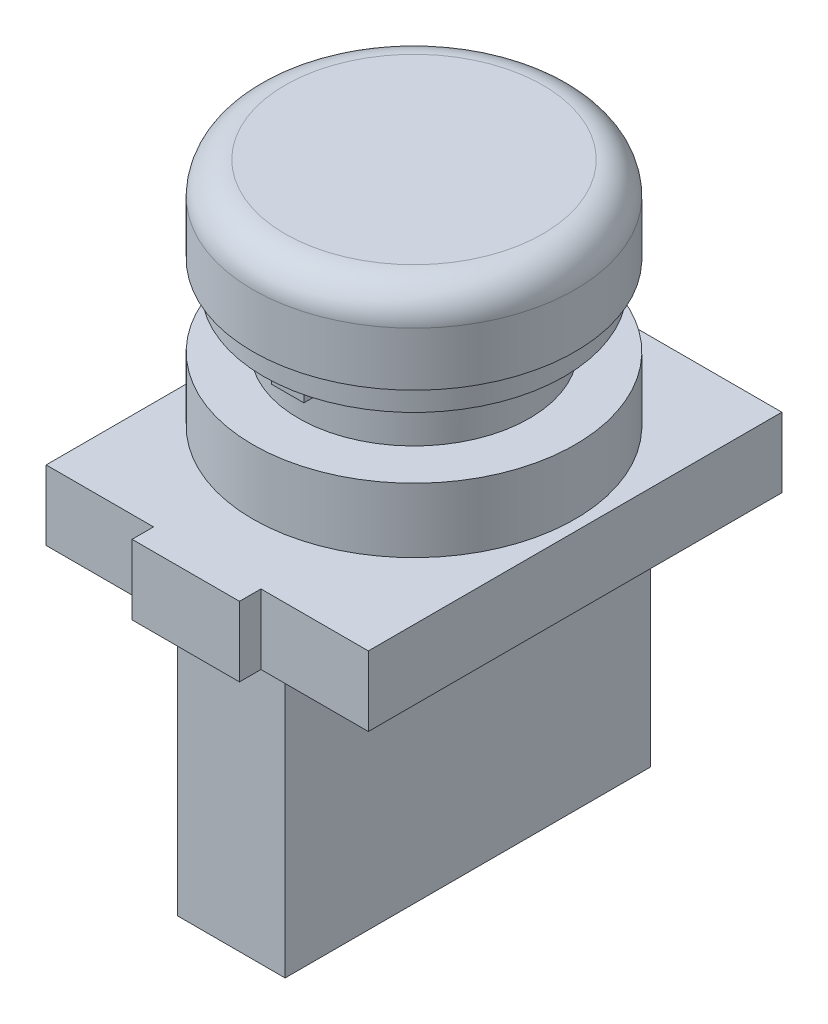
ISO-10303-21;
HEADER;
FILE_DESCRIPTION(('STEP AP214'),'2;1');
FILE_NAME('part.step','',(''),(''),'','','');
FILE_SCHEMA(('AUTOMOTIVE_DESIGN { 1 0 10303 214 1 1 1 1 }'));
ENDSEC;
DATA;
#1=APPLICATION_CONTEXT('core data for automotive mechanical design processes');
#2=APPLICATION_PROTOCOL_DEFINITION('international standard','automotive_design',2000,#1);
#3=PRODUCT_CONTEXT('',#1,'mechanical');
#4=PRODUCT('Part','Part','',(#3));
#5=PRODUCT_RELATED_PRODUCT_CATEGORY('part','',(#4));
#6=PRODUCT_DEFINITION_FORMATION('','',#4);
#7=PRODUCT_DEFINITION_CONTEXT('part definition',#1,'design');
#8=PRODUCT_DEFINITION('design','',#6,#7);
#9=PRODUCT_DEFINITION_SHAPE('','',#8);
#10=(LENGTH_UNIT() NAMED_UNIT(*) SI_UNIT(.MILLI.,.METRE.));
#11=(NAMED_UNIT(*) PLANE_ANGLE_UNIT() SI_UNIT($,.RADIAN.));
#12=(NAMED_UNIT(*) SI_UNIT($,.STERADIAN.) SOLID_ANGLE_UNIT());
#13=UNCERTAINTY_MEASURE_WITH_UNIT(LENGTH_MEASURE(1.E-05),#10,'distance_accuracy_value','');
#14=(GEOMETRIC_REPRESENTATION_CONTEXT(3) GLOBAL_UNCERTAINTY_ASSIGNED_CONTEXT((#13)) GLOBAL_UNIT_ASSIGNED_CONTEXT((#10,
#11,#12)) REPRESENTATION_CONTEXT('',''));
#15=CARTESIAN_POINT('',(0.,0.,0.));
#16=DIRECTION('',(0.,0.,1.));
#17=DIRECTION('',(1.,0.,0.));
#18=AXIS2_PLACEMENT_3D('',#15,#16,#17);
#19=CARTESIAN_POINT('',(0.,-18.5,0.));
#20=DIRECTION('',(0.,-1.,0.));
#21=DIRECTION('',(0.,0.,-1.));
#22=AXIS2_PLACEMENT_3D('',#19,#20,#21);
#23=PLANE('',#22);
#24=DIRECTION('',(1.,0.,0.));
#25=VECTOR('',#24,1.);
#26=CARTESIAN_POINT('',(0.,-18.5,19.25));
#27=LINE('',#26,#25);
#28=CARTESIAN_POINT('',(5.,-18.5,19.25));
#29=VERTEX_POINT('',#28);
#30=CARTESIAN_POINT('',(15.,-18.5,19.25));
#31=VERTEX_POINT('',#30);
#32=EDGE_CURVE('E246',#29,#31,#27,.T.);
#33=ORIENTED_EDGE('',*,*,#32,.F.);
#34=DIRECTION('',(0.,0.,-1.));
#35=VECTOR('',#34,1.);
#36=CARTESIAN_POINT('',(5.,-18.5,21.25));
#37=LINE('',#36,#35);
#38=CARTESIAN_POINT('',(5.,-18.5,21.25));
#39=VERTEX_POINT('',#38);
#40=EDGE_CURVE('E226',#39,#29,#37,.T.);
#41=ORIENTED_EDGE('',*,*,#40,.F.);
#42=DIRECTION('',(1.,0.,0.));
#43=VECTOR('',#42,1.);
#44=CARTESIAN_POINT('',(-5.,-18.5,21.25));
#45=LINE('',#44,#43);
#46=CARTESIAN_POINT('',(-5.,-18.5,21.25));
#47=VERTEX_POINT('',#46);
#48=EDGE_CURVE('E211',#47,#39,#45,.T.);
#49=ORIENTED_EDGE('',*,*,#48,.F.);
#50=DIRECTION('',(0.,0.,-1.));
#51=VECTOR('',#50,1.);
#52=CARTESIAN_POINT('',(-5.,-18.5,21.25));
#53=LINE('',#52,#51);
#54=CARTESIAN_POINT('',(-5.,-18.5,19.25));
#55=VERTEX_POINT('',#54);
#56=EDGE_CURVE('E206',#47,#55,#53,.T.);
#57=ORIENTED_EDGE('',*,*,#56,.T.);
#58=CARTESIAN_POINT('',(-15.,-18.5,19.25));
#59=VERTEX_POINT('',#58);
#60=EDGE_CURVE('E261',#59,#55,#27,.T.);
#61=ORIENTED_EDGE('',*,*,#60,.F.);
#62=DIRECTION('',(0.,0.,-1.));
#63=VECTOR('',#62,1.);
#64=CARTESIAN_POINT('',(-15.,-18.5,0.));
#65=LINE('',#64,#63);
#66=CARTESIAN_POINT('',(-15.,-18.5,-19.25));
#67=VERTEX_POINT('',#66);
#68=EDGE_CURVE('E258',#59,#67,#65,.T.);
#69=ORIENTED_EDGE('',*,*,#68,.T.);
#70=DIRECTION('',(1.,0.,0.));
#71=VECTOR('',#70,1.);
#72=CARTESIAN_POINT('',(0.,-18.5,-19.25));
#73=LINE('',#72,#71);
#74=CARTESIAN_POINT('',(15.,-18.5,-19.25));
#75=VERTEX_POINT('',#74);
#76=EDGE_CURVE('E256',#67,#75,#73,.T.);
#77=ORIENTED_EDGE('',*,*,#76,.T.);
#78=DIRECTION('',(0.,0.,-1.));
#79=VECTOR('',#78,1.);
#80=CARTESIAN_POINT('',(15.,-18.5,0.));
#81=LINE('',#80,#79);
#82=EDGE_CURVE('E242',#31,#75,#81,.T.);
#83=ORIENTED_EDGE('',*,*,#82,.F.);
#84=EDGE_LOOP('',(#33,#41,#49,#57,#61,#69,#77,#83));
#85=FACE_BOUND('',#84,.T.);
#86=DIRECTION('',(-1.,0.,0.));
#87=VECTOR('',#86,1.);
#88=CARTESIAN_POINT('',(-5.,-18.5,17.));
#89=LINE('',#88,#87);
#90=CARTESIAN_POINT('',(5.,-18.5,17.));
#91=VERTEX_POINT('',#90);
#92=CARTESIAN_POINT('',(-5.,-18.5,17.));
#93=VERTEX_POINT('',#92);
#94=EDGE_CURVE('E278',#91,#93,#89,.T.);
#95=ORIENTED_EDGE('',*,*,#94,.F.);
#96=DIRECTION('',(0.,0.,1.));
#97=VECTOR('',#96,1.);
#98=CARTESIAN_POINT('',(5.,-18.5,17.));
#99=LINE('',#98,#97);
#100=CARTESIAN_POINT('',(5.,-18.5,-17.));
#101=VERTEX_POINT('',#100);
#102=EDGE_CURVE('E281',#101,#91,#99,.T.);
#103=ORIENTED_EDGE('',*,*,#102,.F.);
#104=DIRECTION('',(1.,0.,0.));
#105=VECTOR('',#104,1.);
#106=CARTESIAN_POINT('',(-5.,-18.5,-17.));
#107=LINE('',#106,#105);
#108=CARTESIAN_POINT('',(-5.,-18.5,-17.));
#109=VERTEX_POINT('',#108);
#110=EDGE_CURVE('E273',#109,#101,#107,.T.);
#111=ORIENTED_EDGE('',*,*,#110,.F.);
#112=DIRECTION('',(0.,0.,-1.));
#113=VECTOR('',#112,1.);
#114=CARTESIAN_POINT('',(-5.,-18.5,17.));
#115=LINE('',#114,#113);
#116=EDGE_CURVE('E276',#93,#109,#115,.T.);
#117=ORIENTED_EDGE('',*,*,#116,.F.);
#118=EDGE_LOOP('',(#95,#103,#111,#117));
#119=FACE_BOUND('',#118,.T.);
#120=ADVANCED_FACE('F136',(#85,#119),#23,.T.);
#121=CARTESIAN_POINT('',(0.,-18.5,19.25));
#122=DIRECTION('',(0.,0.,1.));
#123=DIRECTION('',(1.,0.,0.));
#124=AXIS2_PLACEMENT_3D('',#121,#122,#123);
#125=PLANE('',#124);
#126=DIRECTION('',(1.,0.,0.));
#127=VECTOR('',#126,1.);
#128=CARTESIAN_POINT('',(0.,-12.,19.25));
#129=LINE('',#128,#127);
#130=CARTESIAN_POINT('',(-15.,-12.,19.25));
#131=VERTEX_POINT('',#130);
#132=CARTESIAN_POINT('',(-5.,-12.,19.25));
#133=VERTEX_POINT('',#132);
#134=EDGE_CURVE('E219',#131,#133,#129,.T.);
#135=ORIENTED_EDGE('',*,*,#134,.F.);
#136=DIRECTION('',(0.,1.,0.));
#137=VECTOR('',#136,1.);
#138=CARTESIAN_POINT('',(-15.,-18.5,19.25));
#139=LINE('',#138,#137);
#140=EDGE_CURVE('E234',#59,#131,#139,.T.);
#141=ORIENTED_EDGE('',*,*,#140,.F.);
#142=ORIENTED_EDGE('',*,*,#60,.T.);
#143=DIRECTION('',(0.,1.,0.));
#144=VECTOR('',#143,1.);
#145=CARTESIAN_POINT('',(-5.,-18.5,19.25));
#146=LINE('',#145,#144);
#147=EDGE_CURVE('E145',#55,#133,#146,.T.);
#148=ORIENTED_EDGE('',*,*,#147,.T.);
#149=EDGE_LOOP('',(#135,#141,#142,#148));
#150=FACE_BOUND('',#149,.T.);
#151=ADVANCED_FACE('F347',(#150),#125,.T.);
#152=CARTESIAN_POINT('',(-15.,-18.5,0.));
#153=DIRECTION('',(1.,0.,0.));
#154=DIRECTION('',(0.,0.,-1.));
#155=AXIS2_PLACEMENT_3D('',#152,#153,#154);
#156=PLANE('',#155);
#157=DIRECTION('',(0.,0.,-1.));
#158=VECTOR('',#157,1.);
#159=CARTESIAN_POINT('',(-15.,-12.,0.));
#160=LINE('',#159,#158);
#161=CARTESIAN_POINT('',(-15.,-12.,-19.25));
#162=VERTEX_POINT('',#161);
#163=EDGE_CURVE('E250',#131,#162,#160,.T.);
#164=ORIENTED_EDGE('',*,*,#163,.T.);
#165=DIRECTION('',(0.,1.,0.));
#166=VECTOR('',#165,1.);
#167=CARTESIAN_POINT('',(-15.,-18.5,-19.25));
#168=LINE('',#167,#166);
#169=EDGE_CURVE('E236',#67,#162,#168,.T.);
#170=ORIENTED_EDGE('',*,*,#169,.F.);
#171=ORIENTED_EDGE('',*,*,#68,.F.);
#172=ORIENTED_EDGE('',*,*,#140,.T.);
#173=EDGE_LOOP('',(#164,#170,#171,#172));
#174=FACE_BOUND('',#173,.T.);
#175=ADVANCED_FACE('F335',(#174),#156,.F.);
#176=CARTESIAN_POINT('',(0.,-18.5,-19.25));
#177=DIRECTION('',(0.,0.,1.));
#178=DIRECTION('',(1.,0.,0.));
#179=AXIS2_PLACEMENT_3D('',#176,#177,#178);
#180=PLANE('',#179);
#181=DIRECTION('',(1.,0.,0.));
#182=VECTOR('',#181,1.);
#183=CARTESIAN_POINT('',(0.,-12.,-19.25));
#184=LINE('',#183,#182);
#185=CARTESIAN_POINT('',(15.,-12.,-19.25));
#186=VERTEX_POINT('',#185);
#187=EDGE_CURVE('E247',#162,#186,#184,.T.);
#188=ORIENTED_EDGE('',*,*,#187,.T.);
#189=DIRECTION('',(0.,1.,0.));
#190=VECTOR('',#189,1.);
#191=CARTESIAN_POINT('',(15.,-18.5,-19.25));
#192=LINE('',#191,#190);
#193=EDGE_CURVE('E239',#75,#186,#192,.T.);
#194=ORIENTED_EDGE('',*,*,#193,.F.);
#195=ORIENTED_EDGE('',*,*,#76,.F.);
#196=ORIENTED_EDGE('',*,*,#169,.T.);
#197=EDGE_LOOP('',(#188,#194,#195,#196));
#198=FACE_BOUND('',#197,.T.);
#199=ADVANCED_FACE('F338',(#198),#180,.F.);
#200=CARTESIAN_POINT('',(15.,-18.5,0.));
#201=DIRECTION('',(1.,0.,0.));
#202=DIRECTION('',(0.,0.,-1.));
#203=AXIS2_PLACEMENT_3D('',#200,#201,#202);
#204=PLANE('',#203);
#205=DIRECTION('',(0.,0.,-1.));
#206=VECTOR('',#205,1.);
#207=CARTESIAN_POINT('',(15.,-12.,0.));
#208=LINE('',#207,#206);
#209=CARTESIAN_POINT('',(15.,-12.,19.25));
#210=VERTEX_POINT('',#209);
#211=EDGE_CURVE('E243',#210,#186,#208,.T.);
#212=ORIENTED_EDGE('',*,*,#211,.F.);
#213=DIRECTION('',(0.,1.,0.));
#214=VECTOR('',#213,1.);
#215=CARTESIAN_POINT('',(15.,-18.5,19.25));
#216=LINE('',#215,#214);
#217=EDGE_CURVE('E162',#31,#210,#216,.T.);
#218=ORIENTED_EDGE('',*,*,#217,.F.);
#219=ORIENTED_EDGE('',*,*,#82,.T.);
#220=ORIENTED_EDGE('',*,*,#193,.T.);
#221=EDGE_LOOP('',(#212,#218,#219,#220));
#222=FACE_BOUND('',#221,.T.);
#223=ADVANCED_FACE('F339',(#222),#204,.T.);
#224=CARTESIAN_POINT('',(5.,-12.,19.25));
#225=VERTEX_POINT('',#224);
#226=EDGE_CURVE('E252',#225,#210,#129,.T.);
#227=ORIENTED_EDGE('',*,*,#226,.F.);
#228=DIRECTION('',(0.,1.,0.));
#229=VECTOR('',#228,1.);
#230=CARTESIAN_POINT('',(5.,-18.5,19.25));
#231=LINE('',#230,#229);
#232=EDGE_CURVE('E13',#29,#225,#231,.T.);
#233=ORIENTED_EDGE('',*,*,#232,.F.);
#234=ORIENTED_EDGE('',*,*,#32,.T.);
#235=ORIENTED_EDGE('',*,*,#217,.T.);
#236=EDGE_LOOP('',(#227,#233,#234,#235));
#237=FACE_BOUND('',#236,.T.);
#238=ADVANCED_FACE('F343',(#237),#125,.T.);
#239=CARTESIAN_POINT('',(0.,-12.,0.));
#240=DIRECTION('',(0.,-1.,0.));
#241=DIRECTION('',(0.,0.,-1.));
#242=AXIS2_PLACEMENT_3D('',#239,#240,#241);
#243=PLANE('',#242);
#244=DIRECTION('',(0.,0.,-1.));
#245=VECTOR('',#244,1.);
#246=CARTESIAN_POINT('',(5.,-12.,21.25));
#247=LINE('',#246,#245);
#248=CARTESIAN_POINT('',(5.,-12.,21.25));
#249=VERTEX_POINT('',#248);
#250=EDGE_CURVE('E220',#249,#225,#247,.T.);
#251=ORIENTED_EDGE('',*,*,#250,.T.);
#252=ORIENTED_EDGE('',*,*,#226,.T.);
#253=ORIENTED_EDGE('',*,*,#211,.T.);
#254=ORIENTED_EDGE('',*,*,#187,.F.);
#255=ORIENTED_EDGE('',*,*,#163,.F.);
#256=ORIENTED_EDGE('',*,*,#134,.T.);
#257=DIRECTION('',(0.,0.,-1.));
#258=VECTOR('',#257,1.);
#259=CARTESIAN_POINT('',(-5.,-12.,21.25));
#260=LINE('',#259,#258);
#261=CARTESIAN_POINT('',(-5.,-12.,21.25));
#262=VERTEX_POINT('',#261);
#263=EDGE_CURVE('E203',#262,#133,#260,.T.);
#264=ORIENTED_EDGE('',*,*,#263,.F.);
#265=DIRECTION('',(1.,0.,0.));
#266=VECTOR('',#265,1.);
#267=CARTESIAN_POINT('',(-5.,-12.,21.25));
#268=LINE('',#267,#266);
#269=EDGE_CURVE('E216',#262,#249,#268,.T.);
#270=ORIENTED_EDGE('',*,*,#269,.T.);
#271=EDGE_LOOP('',(#251,#252,#253,#254,#255,#256,#264,#270));
#272=FACE_BOUND('',#271,.T.);
#273=ADVANCED_FACE('F215',(#272),#243,.F.);
#274=CARTESIAN_POINT('',(5.,-18.5,21.25));
#275=DIRECTION('',(1.,0.,0.));
#276=DIRECTION('',(0.,0.,-1.));
#277=AXIS2_PLACEMENT_3D('',#274,#275,#276);
#278=PLANE('',#277);
#279=ORIENTED_EDGE('',*,*,#40,.T.);
#280=ORIENTED_EDGE('',*,*,#232,.T.);
#281=ORIENTED_EDGE('',*,*,#250,.F.);
#282=DIRECTION('',(0.,1.,0.));
#283=VECTOR('',#282,1.);
#284=CARTESIAN_POINT('',(5.,-18.5,21.25));
#285=LINE('',#284,#283);
#286=EDGE_CURVE('E140',#39,#249,#285,.T.);
#287=ORIENTED_EDGE('',*,*,#286,.F.);
#288=EDGE_LOOP('',(#279,#280,#281,#287));
#289=FACE_BOUND('',#288,.T.);
#290=ADVANCED_FACE('F345',(#289),#278,.T.);
#291=CARTESIAN_POINT('',(-5.,-18.5,21.25));
#292=DIRECTION('',(0.,0.,1.));
#293=DIRECTION('',(1.,0.,0.));
#294=AXIS2_PLACEMENT_3D('',#291,#292,#293);
#295=PLANE('',#294);
#296=ORIENTED_EDGE('',*,*,#269,.F.);
#297=DIRECTION('',(0.,1.,0.));
#298=VECTOR('',#297,1.);
#299=CARTESIAN_POINT('',(-5.,-18.5,21.25));
#300=LINE('',#299,#298);
#301=EDGE_CURVE('E200',#47,#262,#300,.T.);
#302=ORIENTED_EDGE('',*,*,#301,.F.);
#303=ORIENTED_EDGE('',*,*,#48,.T.);
#304=ORIENTED_EDGE('',*,*,#286,.T.);
#305=EDGE_LOOP('',(#296,#302,#303,#304));
#306=FACE_BOUND('',#305,.T.);
#307=ADVANCED_FACE('F223',(#306),#295,.T.);
#308=CARTESIAN_POINT('',(-5.,-18.5,21.25));
#309=DIRECTION('',(1.,0.,0.));
#310=DIRECTION('',(0.,0.,-1.));
#311=AXIS2_PLACEMENT_3D('',#308,#309,#310);
#312=PLANE('',#311);
#313=ORIENTED_EDGE('',*,*,#147,.F.);
#314=ORIENTED_EDGE('',*,*,#56,.F.);
#315=ORIENTED_EDGE('',*,*,#301,.T.);
#316=ORIENTED_EDGE('',*,*,#263,.T.);
#317=EDGE_LOOP('',(#313,#314,#315,#316));
#318=FACE_BOUND('',#317,.T.);
#319=ADVANCED_FACE('F138',(#318),#312,.F.);
#320=CARTESIAN_POINT('',(5.,-44.5,17.));
#321=DIRECTION('',(-1.,0.,0.));
#322=DIRECTION('',(0.,0.,1.));
#323=AXIS2_PLACEMENT_3D('',#320,#321,#322);
#324=PLANE('',#323);
#325=ORIENTED_EDGE('',*,*,#102,.T.);
#326=DIRECTION('',(0.,1.,0.));
#327=VECTOR('',#326,1.);
#328=CARTESIAN_POINT('',(5.,-44.5,17.));
#329=LINE('',#328,#327);
#330=CARTESIAN_POINT('',(5.,-44.5,17.));
#331=VERTEX_POINT('',#330);
#332=EDGE_CURVE('E221',#331,#91,#329,.T.);
#333=ORIENTED_EDGE('',*,*,#332,.F.);
#334=DIRECTION('',(0.,0.,1.));
#335=VECTOR('',#334,1.);
#336=CARTESIAN_POINT('',(5.,-44.5,17.));
#337=LINE('',#336,#335);
#338=CARTESIAN_POINT('',(5.,-44.5,-17.));
#339=VERTEX_POINT('',#338);
#340=EDGE_CURVE('E275',#339,#331,#337,.T.);
#341=ORIENTED_EDGE('',*,*,#340,.F.);
#342=DIRECTION('',(0.,1.,0.));
#343=VECTOR('',#342,1.);
#344=CARTESIAN_POINT('',(5.,-44.5,-17.));
#345=LINE('',#344,#343);
#346=EDGE_CURVE('E269',#339,#101,#345,.T.);
#347=ORIENTED_EDGE('',*,*,#346,.T.);
#348=EDGE_LOOP('',(#325,#333,#341,#347));
#349=FACE_BOUND('',#348,.T.);
#350=ADVANCED_FACE('F305',(#349),#324,.F.);
#351=CARTESIAN_POINT('',(-5.,-44.5,17.));
#352=DIRECTION('',(0.,0.,-1.));
#353=DIRECTION('',(-1.,0.,0.));
#354=AXIS2_PLACEMENT_3D('',#351,#352,#353);
#355=PLANE('',#354);
#356=ORIENTED_EDGE('',*,*,#94,.T.);
#357=DIRECTION('',(0.,1.,0.));
#358=VECTOR('',#357,1.);
#359=CARTESIAN_POINT('',(-5.,-44.5,17.));
#360=LINE('',#359,#358);
#361=CARTESIAN_POINT('',(-5.,-44.5,17.));
#362=VERTEX_POINT('',#361);
#363=EDGE_CURVE('E265',#362,#93,#360,.T.);
#364=ORIENTED_EDGE('',*,*,#363,.F.);
#365=DIRECTION('',(-1.,0.,0.));
#366=VECTOR('',#365,1.);
#367=CARTESIAN_POINT('',(-5.,-44.5,17.));
#368=LINE('',#367,#366);
#369=EDGE_CURVE('E289',#331,#362,#368,.T.);
#370=ORIENTED_EDGE('',*,*,#369,.F.);
#371=ORIENTED_EDGE('',*,*,#332,.T.);
#372=EDGE_LOOP('',(#356,#364,#370,#371));
#373=FACE_BOUND('',#372,.T.);
#374=ADVANCED_FACE('F310',(#373),#355,.F.);
#375=CARTESIAN_POINT('',(-5.,-44.5,17.));
#376=DIRECTION('',(1.,0.,0.));
#377=DIRECTION('',(0.,0.,-1.));
#378=AXIS2_PLACEMENT_3D('',#375,#376,#377);
#379=PLANE('',#378);
#380=ORIENTED_EDGE('',*,*,#116,.T.);
#381=DIRECTION('',(0.,1.,0.));
#382=VECTOR('',#381,1.);
#383=CARTESIAN_POINT('',(-5.,-44.5,-17.));
#384=LINE('',#383,#382);
#385=CARTESIAN_POINT('',(-5.,-44.5,-17.));
#386=VERTEX_POINT('',#385);
#387=EDGE_CURVE('E153',#386,#109,#384,.T.);
#388=ORIENTED_EDGE('',*,*,#387,.F.);
#389=DIRECTION('',(0.,0.,-1.));
#390=VECTOR('',#389,1.);
#391=CARTESIAN_POINT('',(-5.,-44.5,17.));
#392=LINE('',#391,#390);
#393=EDGE_CURVE('E286',#362,#386,#392,.T.);
#394=ORIENTED_EDGE('',*,*,#393,.F.);
#395=ORIENTED_EDGE('',*,*,#363,.T.);
#396=EDGE_LOOP('',(#380,#388,#394,#395));
#397=FACE_BOUND('',#396,.T.);
#398=ADVANCED_FACE('F428',(#397),#379,.F.);
#399=CARTESIAN_POINT('',(-5.,-44.5,-17.));
#400=DIRECTION('',(0.,0.,1.));
#401=DIRECTION('',(1.,0.,0.));
#402=AXIS2_PLACEMENT_3D('',#399,#400,#401);
#403=PLANE('',#402);
#404=ORIENTED_EDGE('',*,*,#110,.T.);
#405=ORIENTED_EDGE('',*,*,#346,.F.);
#406=DIRECTION('',(1.,0.,0.));
#407=VECTOR('',#406,1.);
#408=CARTESIAN_POINT('',(-5.,-44.5,-17.));
#409=LINE('',#408,#407);
#410=EDGE_CURVE('E272',#386,#339,#409,.T.);
#411=ORIENTED_EDGE('',*,*,#410,.F.);
#412=ORIENTED_EDGE('',*,*,#387,.T.);
#413=EDGE_LOOP('',(#404,#405,#411,#412));
#414=FACE_BOUND('',#413,.T.);
#415=ADVANCED_FACE('F437',(#414),#403,.F.);
#416=CARTESIAN_POINT('',(0.,-44.5,0.));
#417=DIRECTION('',(0.,-1.,0.));
#418=DIRECTION('',(0.,0.,-1.));
#419=AXIS2_PLACEMENT_3D('',#416,#417,#418);
#420=PLANE('',#419);
#421=ORIENTED_EDGE('',*,*,#340,.T.);
#422=ORIENTED_EDGE('',*,*,#369,.T.);
#423=ORIENTED_EDGE('',*,*,#393,.T.);
#424=ORIENTED_EDGE('',*,*,#410,.T.);
#425=EDGE_LOOP('',(#421,#422,#423,#424));
#426=FACE_BOUND('',#425,.T.);
#427=ADVANCED_FACE('F297',(#426),#420,.T.);
#428=CLOSED_SHELL('',(#120,#151,#175,#199,#223,#238,#273,#290,#307,#319,#350,#374,#398,#415,#427));
#429=MANIFOLD_SOLID_BREP('B2',#428);
#430=CARTESIAN_POINT('',(0.,2.5,0.));
#431=DIRECTION('',(0.,-1.,0.));
#432=DIRECTION('',(0.,0.,-1.));
#433=AXIS2_PLACEMENT_3D('',#430,#431,#432);
#434=CYLINDRICAL_SURFACE('',#433,14.);
#435=CARTESIAN_POINT('',(0.,2.5,0.));
#436=DIRECTION('',(0.,1.,0.));
#437=DIRECTION('',(0.,0.,1.));
#438=AXIS2_PLACEMENT_3D('',#435,#436,#437);
#439=CIRCLE('',#438,14.);
#440=CARTESIAN_POINT('',(0.,2.5,14.));
#441=VERTEX_POINT('',#440);
#442=EDGE_CURVE('E572',#441,#441,#439,.T.);
#443=ORIENTED_EDGE('',*,*,#442,.F.);
#444=EDGE_LOOP('',(#443));
#445=FACE_BOUND('',#444,.T.);
#446=CARTESIAN_POINT('',(0.,0.,0.));
#447=DIRECTION('',(0.,1.,0.));
#448=DIRECTION('',(0.,0.,1.));
#449=AXIS2_PLACEMENT_3D('',#446,#447,#448);
#450=CIRCLE('',#449,14.);
#451=CARTESIAN_POINT('',(0.,0.,14.));
#452=VERTEX_POINT('',#451);
#453=EDGE_CURVE('E571',#452,#452,#450,.T.);
#454=ORIENTED_EDGE('',*,*,#453,.T.);
#455=EDGE_LOOP('',(#454));
#456=FACE_BOUND('',#455,.T.);
#457=ADVANCED_FACE('F481',(#445,#456),#434,.T.);
#458=CARTESIAN_POINT('',(0.,0.,0.));
#459=DIRECTION('',(0.,1.,0.));
#460=DIRECTION('',(0.,0.,1.));
#461=AXIS2_PLACEMENT_3D('',#458,#459,#460);
#462=PLANE('',#461);
#463=DIRECTION('',(1.,0.,0.));
#464=VECTOR('',#463,1.);
#465=CARTESIAN_POINT('',(-1.5,0.,11.75));
#466=LINE('',#465,#464);
#467=CARTESIAN_POINT('',(-1.5,0.,11.75));
#468=VERTEX_POINT('',#467);
#469=CARTESIAN_POINT('',(1.5,0.,11.75));
#470=VERTEX_POINT('',#469);
#471=EDGE_CURVE('E501',#468,#470,#466,.T.);
#472=ORIENTED_EDGE('',*,*,#471,.T.);
#473=DIRECTION('',(0.,0.,-1.));
#474=VECTOR('',#473,1.);
#475=CARTESIAN_POINT('',(1.5,0.,11.75));
#476=LINE('',#475,#474);
#477=CARTESIAN_POINT('',(1.5,0.,10.6448344280219));
#478=VERTEX_POINT('',#477);
#479=EDGE_CURVE('E496',#470,#478,#476,.T.);
#480=ORIENTED_EDGE('',*,*,#479,.T.);
#481=CARTESIAN_POINT('',(0.,0.,0.));
#482=DIRECTION('',(0.,-1.,0.));
#483=DIRECTION('',(0.,0.,-1.));
#484=AXIS2_PLACEMENT_3D('',#481,#482,#483);
#485=CIRCLE('',#484,10.75);
#486=CARTESIAN_POINT('',(-1.5,0.,10.6448344280219));
#487=VERTEX_POINT('',#486);
#488=EDGE_CURVE('E539',#487,#478,#485,.T.);
#489=ORIENTED_EDGE('',*,*,#488,.F.);
#490=DIRECTION('',(0.,0.,-1.));
#491=VECTOR('',#490,1.);
#492=CARTESIAN_POINT('',(-1.5,0.,11.75));
#493=LINE('',#492,#491);
#494=EDGE_CURVE('E549',#468,#487,#493,.T.);
#495=ORIENTED_EDGE('',*,*,#494,.F.);
#496=EDGE_LOOP('',(#472,#480,#489,#495));
#497=FACE_BOUND('',#496,.T.);
#498=ORIENTED_EDGE('',*,*,#453,.F.);
#499=EDGE_LOOP('',(#498));
#500=FACE_BOUND('',#499,.T.);
#501=ADVANCED_FACE('F594',(#497,#500),#462,.F.);
#502=CARTESIAN_POINT('',(0.,10.5,0.));
#503=DIRECTION('',(0.,-1.,0.));
#504=DIRECTION('',(0.,0.,-1.));
#505=AXIS2_PLACEMENT_3D('',#502,#503,#504);
#506=CYLINDRICAL_SURFACE('',#505,15.);
#507=CARTESIAN_POINT('',(0.,7.5,0.));
#508=DIRECTION('',(0.,1.,0.));
#509=DIRECTION('',(0.,0.,1.));
#510=AXIS2_PLACEMENT_3D('',#507,#508,#509);
#511=CIRCLE('',#510,15.);
#512=CARTESIAN_POINT('',(0.,7.5,15.));
#513=VERTEX_POINT('',#512);
#514=EDGE_CURVE('E134',#513,#513,#511,.F.);
#515=ORIENTED_EDGE('',*,*,#514,.T.);
#516=EDGE_LOOP('',(#515));
#517=FACE_BOUND('',#516,.T.);
#518=CARTESIAN_POINT('',(0.,2.5,0.));
#519=DIRECTION('',(0.,1.,0.));
#520=DIRECTION('',(0.,0.,1.));
#521=AXIS2_PLACEMENT_3D('',#518,#519,#520);
#522=CIRCLE('',#521,15.);
#523=CARTESIAN_POINT('',(0.,2.5,15.));
#524=VERTEX_POINT('',#523);
#525=EDGE_CURVE('E558',#524,#524,#522,.T.);
#526=ORIENTED_EDGE('',*,*,#525,.T.);
#527=EDGE_LOOP('',(#526));
#528=FACE_BOUND('',#527,.T.);
#529=ADVANCED_FACE('F599',(#517,#528),#506,.T.);
#530=CARTESIAN_POINT('',(0.,10.5,0.));
#531=DIRECTION('',(0.,1.,0.));
#532=DIRECTION('',(0.,0.,1.));
#533=AXIS2_PLACEMENT_3D('',#530,#531,#532);
#534=PLANE('',#533);
#535=CARTESIAN_POINT('',(0.,10.5,0.));
#536=DIRECTION('',(0.,1.,0.));
#537=DIRECTION('',(0.,0.,1.));
#538=AXIS2_PLACEMENT_3D('',#535,#536,#537);
#539=CIRCLE('',#538,12.);
#540=CARTESIAN_POINT('',(0.,10.5,12.));
#541=VERTEX_POINT('',#540);
#542=EDGE_CURVE('E489',#541,#541,#539,.T.);
#543=ORIENTED_EDGE('',*,*,#542,.T.);
#544=EDGE_LOOP('',(#543));
#545=FACE_BOUND('',#544,.T.);
#546=ADVANCED_FACE('F579',(#545),#534,.T.);
#547=CARTESIAN_POINT('',(0.,2.5,0.));
#548=DIRECTION('',(0.,1.,0.));
#549=DIRECTION('',(0.,0.,1.));
#550=AXIS2_PLACEMENT_3D('',#547,#548,#549);
#551=PLANE('',#550);
#552=ORIENTED_EDGE('',*,*,#442,.T.);
#553=EDGE_LOOP('',(#552));
#554=FACE_BOUND('',#553,.T.);
#555=ORIENTED_EDGE('',*,*,#525,.F.);
#556=EDGE_LOOP('',(#555));
#557=FACE_BOUND('',#556,.T.);
#558=ADVANCED_FACE('F582',(#554,#557),#551,.F.);
#559=CARTESIAN_POINT('',(0.,7.5,0.));
#560=DIRECTION('',(0.,1.,0.));
#561=DIRECTION('',(0.,0.,1.));
#562=AXIS2_PLACEMENT_3D('',#559,#560,#561);
#563=TOROIDAL_SURFACE('',#562,12.,3.);
#564=ORIENTED_EDGE('',*,*,#514,.F.);
#565=EDGE_LOOP('',(#564));
#566=FACE_BOUND('',#565,.T.);
#567=ORIENTED_EDGE('',*,*,#542,.F.);
#568=EDGE_LOOP('',(#567));
#569=FACE_BOUND('',#568,.T.);
#570=ADVANCED_FACE('F483',(#566,#569),#563,.T.);
#571=CARTESIAN_POINT('',(0.,-2.5,0.));
#572=DIRECTION('',(0.,1.,0.));
#573=DIRECTION('',(0.,0.,1.));
#574=AXIS2_PLACEMENT_3D('',#571,#572,#573);
#575=CYLINDRICAL_SURFACE('',#574,10.75);
#576=ORIENTED_EDGE('',*,*,#488,.T.);
#577=DIRECTION('',(0.,1.,0.));
#578=VECTOR('',#577,1.);
#579=CARTESIAN_POINT('',(1.5,-2.5,10.6448344280219));
#580=LINE('',#579,#578);
#581=CARTESIAN_POINT('',(1.5,-2.5,10.6448344280219));
#582=VERTEX_POINT('',#581);
#583=EDGE_CURVE('E523',#582,#478,#580,.T.);
#584=ORIENTED_EDGE('',*,*,#583,.F.);
#585=CARTESIAN_POINT('',(0.,-2.5,0.));
#586=DIRECTION('',(0.,-1.,0.));
#587=DIRECTION('',(0.,0.,-1.));
#588=AXIS2_PLACEMENT_3D('',#585,#586,#587);
#589=CIRCLE('',#588,10.75);
#590=CARTESIAN_POINT('',(-1.5,-2.5,10.6448344280219));
#591=VERTEX_POINT('',#590);
#592=EDGE_CURVE('E538',#582,#591,#589,.T.);
#593=ORIENTED_EDGE('',*,*,#592,.T.);
#594=DIRECTION('',(0.,1.,0.));
#595=VECTOR('',#594,1.);
#596=CARTESIAN_POINT('',(-1.5,-2.5,10.6448344280219));
#597=LINE('',#596,#595);
#598=EDGE_CURVE('E540',#591,#487,#597,.T.);
#599=ORIENTED_EDGE('',*,*,#598,.T.);
#600=EDGE_LOOP('',(#576,#584,#593,#599));
#601=FACE_BOUND('',#600,.T.);
#602=CARTESIAN_POINT('',(0.,-5.,0.));
#603=DIRECTION('',(0.,-1.,0.));
#604=DIRECTION('',(0.,0.,-1.));
#605=AXIS2_PLACEMENT_3D('',#602,#603,#604);
#606=CIRCLE('',#605,10.75);
#607=CARTESIAN_POINT('',(0.,-5.,-10.75));
#608=VERTEX_POINT('',#607);
#609=EDGE_CURVE('E545',#608,#608,#606,.T.);
#610=ORIENTED_EDGE('',*,*,#609,.F.);
#611=EDGE_LOOP('',(#610));
#612=FACE_BOUND('',#611,.T.);
#613=ADVANCED_FACE('F535',(#601,#612),#575,.T.);
#614=CARTESIAN_POINT('',(0.,-2.5,0.));
#615=DIRECTION('',(0.,-1.,0.));
#616=DIRECTION('',(0.,0.,-1.));
#617=AXIS2_PLACEMENT_3D('',#614,#615,#616);
#618=PLANE('',#617);
#619=ORIENTED_EDGE('',*,*,#592,.F.);
#620=DIRECTION('',(0.,0.,-1.));
#621=VECTOR('',#620,1.);
#622=CARTESIAN_POINT('',(1.5,-2.5,11.75));
#623=LINE('',#622,#621);
#624=CARTESIAN_POINT('',(1.5,-2.5,11.75));
#625=VERTEX_POINT('',#624);
#626=EDGE_CURVE('E520',#625,#582,#623,.T.);
#627=ORIENTED_EDGE('',*,*,#626,.F.);
#628=DIRECTION('',(1.,0.,0.));
#629=VECTOR('',#628,1.);
#630=CARTESIAN_POINT('',(-1.5,-2.5,11.75));
#631=LINE('',#630,#629);
#632=CARTESIAN_POINT('',(-1.5,-2.5,11.75));
#633=VERTEX_POINT('',#632);
#634=EDGE_CURVE('E530',#633,#625,#631,.T.);
#635=ORIENTED_EDGE('',*,*,#634,.F.);
#636=DIRECTION('',(0.,0.,-1.));
#637=VECTOR('',#636,1.);
#638=CARTESIAN_POINT('',(-1.5,-2.5,11.75));
#639=LINE('',#638,#637);
#640=EDGE_CURVE('E531',#633,#591,#639,.T.);
#641=ORIENTED_EDGE('',*,*,#640,.T.);
#642=EDGE_LOOP('',(#619,#627,#635,#641));
#643=FACE_BOUND('',#642,.T.);
#644=ADVANCED_FACE('F543',(#643),#618,.T.);
#645=CARTESIAN_POINT('',(-1.5,-2.5,11.75));
#646=DIRECTION('',(0.,0.,1.));
#647=DIRECTION('',(1.,0.,0.));
#648=AXIS2_PLACEMENT_3D('',#645,#646,#647);
#649=PLANE('',#648);
#650=ORIENTED_EDGE('',*,*,#471,.F.);
#651=DIRECTION('',(0.,1.,0.));
#652=VECTOR('',#651,1.);
#653=CARTESIAN_POINT('',(-1.5,-2.5,11.75));
#654=LINE('',#653,#652);
#655=EDGE_CURVE('E561',#633,#468,#654,.T.);
#656=ORIENTED_EDGE('',*,*,#655,.F.);
#657=ORIENTED_EDGE('',*,*,#634,.T.);
#658=DIRECTION('',(0.,1.,0.));
#659=VECTOR('',#658,1.);
#660=CARTESIAN_POINT('',(1.5,-2.5,11.75));
#661=LINE('',#660,#659);
#662=EDGE_CURVE('E525',#625,#470,#661,.T.);
#663=ORIENTED_EDGE('',*,*,#662,.T.);
#664=EDGE_LOOP('',(#650,#656,#657,#663));
#665=FACE_BOUND('',#664,.T.);
#666=ADVANCED_FACE('F589',(#665),#649,.T.);
#667=CARTESIAN_POINT('',(1.5,-2.5,11.75));
#668=DIRECTION('',(1.,0.,0.));
#669=DIRECTION('',(0.,0.,-1.));
#670=AXIS2_PLACEMENT_3D('',#667,#668,#669);
#671=PLANE('',#670);
#672=ORIENTED_EDGE('',*,*,#583,.T.);
#673=ORIENTED_EDGE('',*,*,#479,.F.);
#674=ORIENTED_EDGE('',*,*,#662,.F.);
#675=ORIENTED_EDGE('',*,*,#626,.T.);
#676=EDGE_LOOP('',(#672,#673,#674,#675));
#677=FACE_BOUND('',#676,.T.);
#678=ADVANCED_FACE('F522',(#677),#671,.T.);
#679=CARTESIAN_POINT('',(-1.5,-2.5,11.75));
#680=DIRECTION('',(1.,0.,0.));
#681=DIRECTION('',(0.,0.,-1.));
#682=AXIS2_PLACEMENT_3D('',#679,#680,#681);
#683=PLANE('',#682);
#684=ORIENTED_EDGE('',*,*,#494,.T.);
#685=ORIENTED_EDGE('',*,*,#598,.F.);
#686=ORIENTED_EDGE('',*,*,#640,.F.);
#687=ORIENTED_EDGE('',*,*,#655,.T.);
#688=EDGE_LOOP('',(#684,#685,#686,#687));
#689=FACE_BOUND('',#688,.T.);
#690=ADVANCED_FACE('F609',(#689),#683,.F.);
#691=CARTESIAN_POINT('',(0.,-11.,0.));
#692=DIRECTION('',(0.,1.,0.));
#693=DIRECTION('',(0.,0.,1.));
#694=AXIS2_PLACEMENT_3D('',#691,#692,#693);
#695=CYLINDRICAL_SURFACE('',#694,15.);
#696=CARTESIAN_POINT('',(0.,-11.,0.));
#697=DIRECTION('',(0.,-1.,0.));
#698=DIRECTION('',(0.,0.,-1.));
#699=AXIS2_PLACEMENT_3D('',#696,#697,#698);
#700=CIRCLE('',#699,15.);
#701=CARTESIAN_POINT('',(0.,-11.,-15.));
#702=VERTEX_POINT('',#701);
#703=EDGE_CURVE('E546',#702,#702,#700,.T.);
#704=ORIENTED_EDGE('',*,*,#703,.F.);
#705=EDGE_LOOP('',(#704));
#706=FACE_BOUND('',#705,.T.);
#707=CARTESIAN_POINT('',(0.,-5.,0.));
#708=DIRECTION('',(0.,-1.,0.));
#709=DIRECTION('',(0.,0.,-1.));
#710=AXIS2_PLACEMENT_3D('',#707,#708,#709);
#711=CIRCLE('',#710,15.);
#712=CARTESIAN_POINT('',(0.,-5.,-15.));
#713=VERTEX_POINT('',#712);
#714=EDGE_CURVE('E552',#713,#713,#711,.T.);
#715=ORIENTED_EDGE('',*,*,#714,.T.);
#716=EDGE_LOOP('',(#715));
#717=FACE_BOUND('',#716,.T.);
#718=ADVANCED_FACE('F612',(#706,#717),#695,.T.);
#719=CARTESIAN_POINT('',(0.,-11.,0.));
#720=DIRECTION('',(0.,-1.,0.));
#721=DIRECTION('',(0.,0.,-1.));
#722=AXIS2_PLACEMENT_3D('',#719,#720,#721);
#723=PLANE('',#722);
#724=CARTESIAN_POINT('',(0.,-11.,0.));
#725=DIRECTION('',(0.,-1.,0.));
#726=DIRECTION('',(0.,0.,-1.));
#727=AXIS2_PLACEMENT_3D('',#724,#725,#726);
#728=CIRCLE('',#727,10.75);
#729=CARTESIAN_POINT('',(0.,-11.,-10.75));
#730=VERTEX_POINT('',#729);
#731=EDGE_CURVE('E644',#730,#730,#728,.T.);
#732=ORIENTED_EDGE('',*,*,#731,.F.);
#733=EDGE_LOOP('',(#732));
#734=FACE_BOUND('',#733,.T.);
#735=ORIENTED_EDGE('',*,*,#703,.T.);
#736=EDGE_LOOP('',(#735));
#737=FACE_BOUND('',#736,.T.);
#738=ADVANCED_FACE('F623',(#734,#737),#723,.T.);
#739=CARTESIAN_POINT('',(0.,-5.,0.));
#740=DIRECTION('',(0.,-1.,0.));
#741=DIRECTION('',(0.,0.,-1.));
#742=AXIS2_PLACEMENT_3D('',#739,#740,#741);
#743=PLANE('',#742);
#744=ORIENTED_EDGE('',*,*,#609,.T.);
#745=EDGE_LOOP('',(#744));
#746=FACE_BOUND('',#745,.T.);
#747=ORIENTED_EDGE('',*,*,#714,.F.);
#748=EDGE_LOOP('',(#747));
#749=FACE_BOUND('',#748,.T.);
#750=ADVANCED_FACE('F625',(#746,#749),#743,.F.);
#751=CARTESIAN_POINT('',(0.,-12.,0.));
#752=DIRECTION('',(0.,1.,0.));
#753=DIRECTION('',(0.,0.,1.));
#754=AXIS2_PLACEMENT_3D('',#751,#752,#753);
#755=CYLINDRICAL_SURFACE('',#754,10.75);
#756=CARTESIAN_POINT('',(0.,-12.,0.));
#757=DIRECTION('',(0.,-1.,0.));
#758=DIRECTION('',(0.,0.,-1.));
#759=AXIS2_PLACEMENT_3D('',#756,#757,#758);
#760=CIRCLE('',#759,10.75);
#761=CARTESIAN_POINT('',(0.,-12.,-10.75));
#762=VERTEX_POINT('',#761);
#763=EDGE_CURVE('E643',#762,#762,#760,.T.);
#764=ORIENTED_EDGE('',*,*,#763,.F.);
#765=EDGE_LOOP('',(#764));
#766=FACE_BOUND('',#765,.T.);
#767=ORIENTED_EDGE('',*,*,#731,.T.);
#768=EDGE_LOOP('',(#767));
#769=FACE_BOUND('',#768,.T.);
#770=ADVANCED_FACE('F628',(#766,#769),#755,.T.);
#771=CARTESIAN_POINT('',(0.,-12.,0.));
#772=DIRECTION('',(0.,-1.,0.));
#773=DIRECTION('',(0.,0.,-1.));
#774=AXIS2_PLACEMENT_3D('',#771,#772,#773);
#775=PLANE('',#774);
#776=ORIENTED_EDGE('',*,*,#763,.T.);
#777=EDGE_LOOP('',(#776));
#778=FACE_BOUND('',#777,.T.);
#779=ADVANCED_FACE('F635',(#778),#775,.T.);
#780=CLOSED_SHELL('',(#457,#501,#529,#546,#558,#570,#613,#644,#666,#678,#690,#718,#738,#750,
#770,#779));
#781=MANIFOLD_SOLID_BREP('B7',#780);
#782=ADVANCED_BREP_SHAPE_REPRESENTATION('',(#18,#429,#781),#14);
#783=SHAPE_DEFINITION_REPRESENTATION(#9,#782);
ENDSEC;
END-ISO-10303-21;
